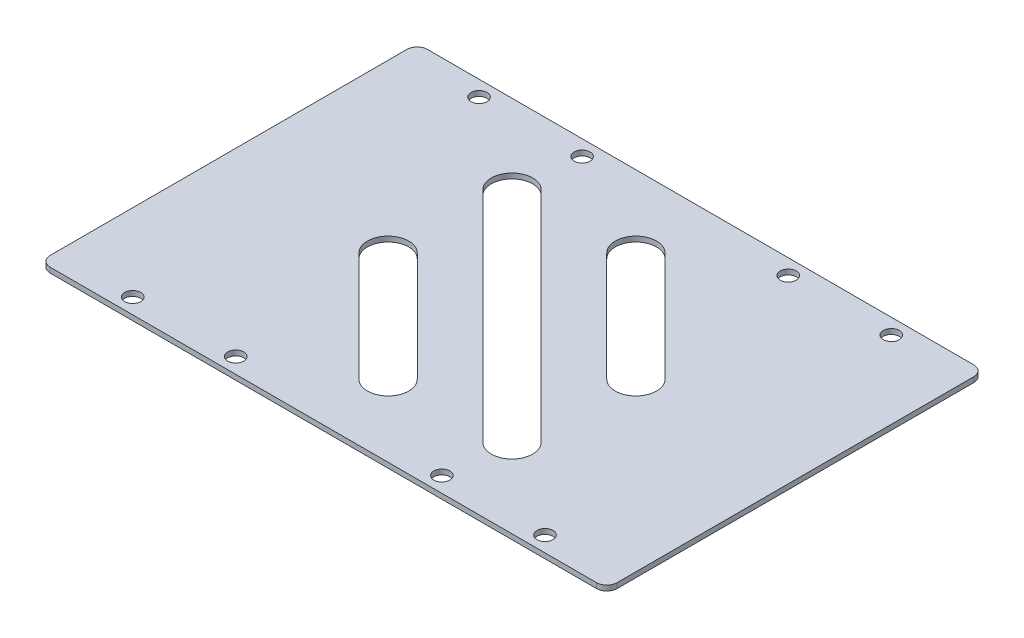
ISO-10303-21;
HEADER;
FILE_DESCRIPTION(('STEP AP214'),'2;1');
FILE_NAME('part.step','',(''),(''),'','','');
FILE_SCHEMA(('AUTOMOTIVE_DESIGN { 1 0 10303 214 1 1 1 1 }'));
ENDSEC;
DATA;
#1=APPLICATION_CONTEXT('core data for automotive mechanical design processes');
#2=APPLICATION_PROTOCOL_DEFINITION('international standard','automotive_design',2000,#1);
#3=PRODUCT_CONTEXT('',#1,'mechanical');
#4=PRODUCT('Part','Part','',(#3));
#5=PRODUCT_RELATED_PRODUCT_CATEGORY('part','',(#4));
#6=PRODUCT_DEFINITION_FORMATION('','',#4);
#7=PRODUCT_DEFINITION_CONTEXT('part definition',#1,'design');
#8=PRODUCT_DEFINITION('design','',#6,#7);
#9=PRODUCT_DEFINITION_SHAPE('','',#8);
#10=(LENGTH_UNIT() NAMED_UNIT(*) SI_UNIT(.MILLI.,.METRE.));
#11=(NAMED_UNIT(*) PLANE_ANGLE_UNIT() SI_UNIT($,.RADIAN.));
#12=(NAMED_UNIT(*) SI_UNIT($,.STERADIAN.) SOLID_ANGLE_UNIT());
#13=UNCERTAINTY_MEASURE_WITH_UNIT(LENGTH_MEASURE(1.E-05),#10,'distance_accuracy_value','');
#14=(GEOMETRIC_REPRESENTATION_CONTEXT(3) GLOBAL_UNCERTAINTY_ASSIGNED_CONTEXT((#13)) GLOBAL_UNIT_ASSIGNED_CONTEXT((#10,
#11,#12)) REPRESENTATION_CONTEXT('',''));
#15=CARTESIAN_POINT('',(0.,0.,0.));
#16=DIRECTION('',(0.,0.,1.));
#17=DIRECTION('',(1.,0.,0.));
#18=AXIS2_PLACEMENT_3D('',#15,#16,#17);
#19=CARTESIAN_POINT('',(55.,1.,-36.6));
#20=DIRECTION('',(-1.,0.,0.));
#21=DIRECTION('',(0.,0.,1.));
#22=AXIS2_PLACEMENT_3D('',#19,#20,#21);
#23=PLANE('',#22);
#24=DIRECTION('',(0.,0.,-1.));
#25=VECTOR('',#24,1.);
#26=CARTESIAN_POINT('',(55.,0.,-36.6));
#27=LINE('',#26,#25);
#28=CARTESIAN_POINT('',(55.,0.,34.6));
#29=VERTEX_POINT('',#28);
#30=CARTESIAN_POINT('',(55.,0.,-34.6));
#31=VERTEX_POINT('',#30);
#32=EDGE_CURVE('E284',#29,#31,#27,.T.);
#33=ORIENTED_EDGE('',*,*,#32,.T.);
#34=DIRECTION('',(0.,-1.,0.));
#35=VECTOR('',#34,1.);
#36=CARTESIAN_POINT('',(55.,1.,-34.6));
#37=LINE('',#36,#35);
#38=CARTESIAN_POINT('',(55.,1.,-34.6));
#39=VERTEX_POINT('',#38);
#40=EDGE_CURVE('E351',#31,#39,#37,.F.);
#41=ORIENTED_EDGE('',*,*,#40,.T.);
#42=DIRECTION('',(0.,0.,-1.));
#43=VECTOR('',#42,1.);
#44=CARTESIAN_POINT('',(55.,1.,-36.6));
#45=LINE('',#44,#43);
#46=CARTESIAN_POINT('',(55.,1.,34.6));
#47=VERTEX_POINT('',#46);
#48=EDGE_CURVE('E270',#47,#39,#45,.T.);
#49=ORIENTED_EDGE('',*,*,#48,.F.);
#50=DIRECTION('',(0.,-1.,0.));
#51=VECTOR('',#50,1.);
#52=CARTESIAN_POINT('',(55.,1.,34.6));
#53=LINE('',#52,#51);
#54=EDGE_CURVE('E348',#47,#29,#53,.T.);
#55=ORIENTED_EDGE('',*,*,#54,.T.);
#56=EDGE_LOOP('',(#33,#41,#49,#55));
#57=FACE_BOUND('',#56,.T.);
#58=ADVANCED_FACE('F42',(#57),#23,.F.);
#59=CARTESIAN_POINT('',(-55.,1.,-36.6));
#60=DIRECTION('',(0.,0.,1.));
#61=DIRECTION('',(1.,0.,0.));
#62=AXIS2_PLACEMENT_3D('',#59,#60,#61);
#63=PLANE('',#62);
#64=DIRECTION('',(-1.,0.,0.));
#65=VECTOR('',#64,1.);
#66=CARTESIAN_POINT('',(-55.,0.,-36.6));
#67=LINE('',#66,#65);
#68=CARTESIAN_POINT('',(53.,0.,-36.6));
#69=VERTEX_POINT('',#68);
#70=CARTESIAN_POINT('',(-53.,0.,-36.6));
#71=VERTEX_POINT('',#70);
#72=EDGE_CURVE('E287',#69,#71,#67,.T.);
#73=ORIENTED_EDGE('',*,*,#72,.T.);
#74=DIRECTION('',(0.,-1.,0.));
#75=VECTOR('',#74,1.);
#76=CARTESIAN_POINT('',(-53.,1.,-36.6));
#77=LINE('',#76,#75);
#78=CARTESIAN_POINT('',(-53.,1.,-36.6));
#79=VERTEX_POINT('',#78);
#80=EDGE_CURVE('E346',#71,#79,#77,.F.);
#81=ORIENTED_EDGE('',*,*,#80,.T.);
#82=DIRECTION('',(-1.,0.,0.));
#83=VECTOR('',#82,1.);
#84=CARTESIAN_POINT('',(-55.,1.,-36.6));
#85=LINE('',#84,#83);
#86=CARTESIAN_POINT('',(53.,1.,-36.6));
#87=VERTEX_POINT('',#86);
#88=EDGE_CURVE('E273',#87,#79,#85,.T.);
#89=ORIENTED_EDGE('',*,*,#88,.F.);
#90=DIRECTION('',(0.,-1.,0.));
#91=VECTOR('',#90,1.);
#92=CARTESIAN_POINT('',(53.,1.,-36.6));
#93=LINE('',#92,#91);
#94=EDGE_CURVE('E343',#87,#69,#93,.T.);
#95=ORIENTED_EDGE('',*,*,#94,.T.);
#96=EDGE_LOOP('',(#73,#81,#89,#95));
#97=FACE_BOUND('',#96,.T.);
#98=ADVANCED_FACE('F411',(#97),#63,.F.);
#99=CARTESIAN_POINT('',(-55.,1.,-36.6));
#100=DIRECTION('',(1.,0.,0.));
#101=DIRECTION('',(0.,0.,-1.));
#102=AXIS2_PLACEMENT_3D('',#99,#100,#101);
#103=PLANE('',#102);
#104=DIRECTION('',(0.,0.,1.));
#105=VECTOR('',#104,1.);
#106=CARTESIAN_POINT('',(-55.,0.,-36.6));
#107=LINE('',#106,#105);
#108=CARTESIAN_POINT('',(-55.,0.,-34.6));
#109=VERTEX_POINT('',#108);
#110=CARTESIAN_POINT('',(-55.,0.,34.6));
#111=VERTEX_POINT('',#110);
#112=EDGE_CURVE('E291',#109,#111,#107,.T.);
#113=ORIENTED_EDGE('',*,*,#112,.T.);
#114=DIRECTION('',(0.,-1.,0.));
#115=VECTOR('',#114,1.);
#116=CARTESIAN_POINT('',(-55.,1.,34.6));
#117=LINE('',#116,#115);
#118=CARTESIAN_POINT('',(-55.,1.,34.6));
#119=VERTEX_POINT('',#118);
#120=EDGE_CURVE('E333',#111,#119,#117,.F.);
#121=ORIENTED_EDGE('',*,*,#120,.T.);
#122=DIRECTION('',(0.,0.,1.));
#123=VECTOR('',#122,1.);
#124=CARTESIAN_POINT('',(-55.,1.,-36.6));
#125=LINE('',#124,#123);
#126=CARTESIAN_POINT('',(-55.,1.,-34.6));
#127=VERTEX_POINT('',#126);
#128=EDGE_CURVE('E277',#127,#119,#125,.T.);
#129=ORIENTED_EDGE('',*,*,#128,.F.);
#130=DIRECTION('',(0.,-1.,0.));
#131=VECTOR('',#130,1.);
#132=CARTESIAN_POINT('',(-55.,1.,-34.6));
#133=LINE('',#132,#131);
#134=EDGE_CURVE('E330',#127,#109,#133,.T.);
#135=ORIENTED_EDGE('',*,*,#134,.T.);
#136=EDGE_LOOP('',(#113,#121,#129,#135));
#137=FACE_BOUND('',#136,.T.);
#138=ADVANCED_FACE('F417',(#137),#103,.F.);
#139=CARTESIAN_POINT('',(-55.,1.,36.6));
#140=DIRECTION('',(0.,0.,-1.));
#141=DIRECTION('',(-1.,0.,0.));
#142=AXIS2_PLACEMENT_3D('',#139,#140,#141);
#143=PLANE('',#142);
#144=DIRECTION('',(1.,0.,0.));
#145=VECTOR('',#144,1.);
#146=CARTESIAN_POINT('',(-55.,1.,36.6));
#147=LINE('',#146,#145);
#148=CARTESIAN_POINT('',(-53.,1.,36.6));
#149=VERTEX_POINT('',#148);
#150=CARTESIAN_POINT('',(53.,1.,36.6));
#151=VERTEX_POINT('',#150);
#152=EDGE_CURVE('E280',#149,#151,#147,.T.);
#153=ORIENTED_EDGE('',*,*,#152,.F.);
#154=DIRECTION('',(0.,-1.,0.));
#155=VECTOR('',#154,1.);
#156=CARTESIAN_POINT('',(-53.,1.,36.6));
#157=LINE('',#156,#155);
#158=CARTESIAN_POINT('',(-53.,0.,36.6));
#159=VERTEX_POINT('',#158);
#160=EDGE_CURVE('E319',#149,#159,#157,.T.);
#161=ORIENTED_EDGE('',*,*,#160,.T.);
#162=DIRECTION('',(1.,0.,0.));
#163=VECTOR('',#162,1.);
#164=CARTESIAN_POINT('',(-55.,0.,36.6));
#165=LINE('',#164,#163);
#166=CARTESIAN_POINT('',(53.,0.,36.6));
#167=VERTEX_POINT('',#166);
#168=EDGE_CURVE('E274',#159,#167,#165,.T.);
#169=ORIENTED_EDGE('',*,*,#168,.T.);
#170=DIRECTION('',(0.,-1.,0.));
#171=VECTOR('',#170,1.);
#172=CARTESIAN_POINT('',(53.,1.,36.6));
#173=LINE('',#172,#171);
#174=EDGE_CURVE('E283',#167,#151,#173,.F.);
#175=ORIENTED_EDGE('',*,*,#174,.T.);
#176=EDGE_LOOP('',(#153,#161,#169,#175));
#177=FACE_BOUND('',#176,.T.);
#178=ADVANCED_FACE('F457',(#177),#143,.F.);
#179=CARTESIAN_POINT('',(0.,1.,0.));
#180=DIRECTION('',(0.,1.,0.));
#181=DIRECTION('',(0.,0.,1.));
#182=AXIS2_PLACEMENT_3D('',#179,#180,#181);
#183=PLANE('',#182);
#184=CARTESIAN_POINT('',(1.41421356237337,1.,-22.6274169979698));
#185=DIRECTION('',(0.,1.,0.));
#186=DIRECTION('',(0.,0.,1.));
#187=AXIS2_PLACEMENT_3D('',#184,#185,#186);
#188=CIRCLE('',#187,3.99999999999999);
#189=CARTESIAN_POINT('',(4.24264068711955,1.,-25.455844122716));
#190=VERTEX_POINT('',#189);
#191=CARTESIAN_POINT('',(-1.41421356237282,1.,-19.7989898732236));
#192=VERTEX_POINT('',#191);
#193=EDGE_CURVE('E57',#190,#192,#188,.T.);
#194=ORIENTED_EDGE('',*,*,#193,.F.);
#195=DIRECTION('',(-0.707106781186548,0.,-0.707106781186547));
#196=VECTOR('',#195,1.);
#197=CARTESIAN_POINT('',(4.24264068711955,1.,-25.455844122716));
#198=LINE('',#197,#196);
#199=CARTESIAN_POINT('',(25.455844122716,1.,-4.24264068711956));
#200=VERTEX_POINT('',#199);
#201=EDGE_CURVE('E212',#200,#190,#198,.T.);
#202=ORIENTED_EDGE('',*,*,#201,.F.);
#203=CARTESIAN_POINT('',(22.6274169979698,1.,-1.41421356237337));
#204=DIRECTION('',(0.,1.,0.));
#205=DIRECTION('',(0.,0.,1.));
#206=AXIS2_PLACEMENT_3D('',#203,#204,#205);
#207=CIRCLE('',#206,3.99999999999999);
#208=CARTESIAN_POINT('',(19.7989898732236,1.,1.41421356237281));
#209=VERTEX_POINT('',#208);
#210=EDGE_CURVE('E218',#209,#200,#207,.T.);
#211=ORIENTED_EDGE('',*,*,#210,.F.);
#212=DIRECTION('',(0.707106781186547,0.,0.707106781186547));
#213=VECTOR('',#212,1.);
#214=CARTESIAN_POINT('',(-1.41421356237282,1.,-19.7989898732236));
#215=LINE('',#214,#213);
#216=EDGE_CURVE('E221',#192,#209,#215,.T.);
#217=ORIENTED_EDGE('',*,*,#216,.F.);
#218=EDGE_LOOP('',(#194,#202,#211,#217));
#219=FACE_BOUND('',#218,.T.);
#220=CARTESIAN_POINT('',(-22.6274169979698,1.,1.41421356237392));
#221=DIRECTION('',(0.,1.,0.));
#222=DIRECTION('',(0.,0.,-1.));
#223=AXIS2_PLACEMENT_3D('',#220,#221,#222);
#224=CIRCLE('',#223,3.99999999999999);
#225=CARTESIAN_POINT('',(-19.7989898732236,1.,-1.41421356237233));
#226=VERTEX_POINT('',#225);
#227=CARTESIAN_POINT('',(-25.4558441227159,1.,4.24264068712017));
#228=VERTEX_POINT('',#227);
#229=EDGE_CURVE('E65',#226,#228,#224,.T.);
#230=ORIENTED_EDGE('',*,*,#229,.F.);
#231=DIRECTION('',(-0.707106781186565,0.,-0.70710678118653));
#232=VECTOR('',#231,1.);
#233=CARTESIAN_POINT('',(-19.7989898732236,1.,-1.41421356237233));
#234=LINE('',#233,#232);
#235=CARTESIAN_POINT('',(1.41421356237329,1.,19.7989898732236));
#236=VERTEX_POINT('',#235);
#237=EDGE_CURVE('E189',#236,#226,#234,.T.);
#238=ORIENTED_EDGE('',*,*,#237,.F.);
#239=CARTESIAN_POINT('',(-1.41421356237282,1.,22.6274169979698));
#240=DIRECTION('',(0.,1.,0.));
#241=DIRECTION('',(0.,0.,-1.));
#242=AXIS2_PLACEMENT_3D('',#239,#240,#241);
#243=CIRCLE('',#242,3.99999999999999);
#244=CARTESIAN_POINT('',(-4.24264068711893,1.,25.4558441227161));
#245=VERTEX_POINT('',#244);
#246=EDGE_CURVE('E195',#245,#236,#243,.T.);
#247=ORIENTED_EDGE('',*,*,#246,.F.);
#248=DIRECTION('',(0.707106781186565,0.,0.70710678118653));
#249=VECTOR('',#248,1.);
#250=CARTESIAN_POINT('',(-25.4558441227159,1.,4.24264068712017));
#251=LINE('',#250,#249);
#252=EDGE_CURVE('E202',#228,#245,#251,.T.);
#253=ORIENTED_EDGE('',*,*,#252,.F.);
#254=EDGE_LOOP('',(#230,#238,#247,#253));
#255=FACE_BOUND('',#254,.T.);
#256=CARTESIAN_POINT('',(-21.2132034355964,1.,-21.2132034355965));
#257=DIRECTION('',(0.,1.,0.));
#258=DIRECTION('',(0.,0.,1.));
#259=AXIS2_PLACEMENT_3D('',#256,#257,#258);
#260=CIRCLE('',#259,4.00000000000001);
#261=CARTESIAN_POINT('',(-18.3847763108502,1.,-24.0416305603427));
#262=VERTEX_POINT('',#261);
#263=CARTESIAN_POINT('',(-24.0416305603426,1.,-18.3847763108503));
#264=VERTEX_POINT('',#263);
#265=EDGE_CURVE('E225',#262,#264,#260,.T.);
#266=ORIENTED_EDGE('',*,*,#265,.F.);
#267=DIRECTION('',(-0.707106781186546,0.,-0.707106781186549));
#268=VECTOR('',#267,1.);
#269=CARTESIAN_POINT('',(-18.3847763108502,1.,-24.0416305603427));
#270=LINE('',#269,#268);
#271=CARTESIAN_POINT('',(24.0416305603426,1.,18.3847763108503));
#272=VERTEX_POINT('',#271);
#273=EDGE_CURVE('E233',#272,#262,#270,.T.);
#274=ORIENTED_EDGE('',*,*,#273,.F.);
#275=CARTESIAN_POINT('',(21.2132034355964,1.,21.2132034355965));
#276=DIRECTION('',(0.,1.,0.));
#277=DIRECTION('',(0.,0.,1.));
#278=AXIS2_PLACEMENT_3D('',#275,#276,#277);
#279=CIRCLE('',#278,4.00000000000001);
#280=CARTESIAN_POINT('',(18.3847763108502,1.,24.0416305603426));
#281=VERTEX_POINT('',#280);
#282=EDGE_CURVE('E230',#281,#272,#279,.T.);
#283=ORIENTED_EDGE('',*,*,#282,.F.);
#284=DIRECTION('',(0.707106781186546,0.,0.707106781186549));
#285=VECTOR('',#284,1.);
#286=CARTESIAN_POINT('',(-24.0416305603426,1.,-18.3847763108503));
#287=LINE('',#286,#285);
#288=EDGE_CURVE('E227',#264,#281,#287,.T.);
#289=ORIENTED_EDGE('',*,*,#288,.F.);
#290=EDGE_LOOP('',(#266,#274,#283,#289));
#291=FACE_BOUND('',#290,.T.);
#292=CARTESIAN_POINT('',(40.,1.,-33.6));
#293=DIRECTION('',(0.,1.,0.));
#294=DIRECTION('',(0.,0.,1.));
#295=AXIS2_PLACEMENT_3D('',#292,#293,#294);
#296=CIRCLE('',#295,1.55);
#297=CARTESIAN_POINT('',(40.,1.,-32.05));
#298=VERTEX_POINT('',#297);
#299=EDGE_CURVE('E255',#298,#298,#296,.T.);
#300=ORIENTED_EDGE('',*,*,#299,.F.);
#301=EDGE_LOOP('',(#300));
#302=FACE_BOUND('',#301,.T.);
#303=CARTESIAN_POINT('',(40.,1.,33.6));
#304=DIRECTION('',(0.,1.,0.));
#305=DIRECTION('',(0.,0.,-1.));
#306=AXIS2_PLACEMENT_3D('',#303,#304,#305);
#307=CIRCLE('',#306,1.55);
#308=CARTESIAN_POINT('',(40.,1.,32.05));
#309=VERTEX_POINT('',#308);
#310=EDGE_CURVE('E259',#309,#309,#307,.T.);
#311=ORIENTED_EDGE('',*,*,#310,.F.);
#312=EDGE_LOOP('',(#311));
#313=FACE_BOUND('',#312,.T.);
#314=CARTESIAN_POINT('',(20.,1.,33.6));
#315=DIRECTION('',(0.,1.,0.));
#316=DIRECTION('',(0.,0.,-1.));
#317=AXIS2_PLACEMENT_3D('',#314,#315,#316);
#318=CIRCLE('',#317,1.55);
#319=CARTESIAN_POINT('',(20.,1.,32.05));
#320=VERTEX_POINT('',#319);
#321=EDGE_CURVE('E262',#320,#320,#318,.T.);
#322=ORIENTED_EDGE('',*,*,#321,.F.);
#323=EDGE_LOOP('',(#322));
#324=FACE_BOUND('',#323,.T.);
#325=CARTESIAN_POINT('',(-20.,1.,33.6));
#326=DIRECTION('',(0.,1.,0.));
#327=DIRECTION('',(0.,0.,1.));
#328=AXIS2_PLACEMENT_3D('',#325,#326,#327);
#329=CIRCLE('',#328,1.55);
#330=CARTESIAN_POINT('',(-20.,1.,35.15));
#331=VERTEX_POINT('',#330);
#332=EDGE_CURVE('E249',#331,#331,#329,.T.);
#333=ORIENTED_EDGE('',*,*,#332,.F.);
#334=EDGE_LOOP('',(#333));
#335=FACE_BOUND('',#334,.T.);
#336=CARTESIAN_POINT('',(-40.,1.,33.6));
#337=DIRECTION('',(0.,1.,0.));
#338=DIRECTION('',(0.,0.,1.));
#339=AXIS2_PLACEMENT_3D('',#336,#337,#338);
#340=CIRCLE('',#339,1.55);
#341=CARTESIAN_POINT('',(-40.,1.,35.15));
#342=VERTEX_POINT('',#341);
#343=EDGE_CURVE('E246',#342,#342,#340,.T.);
#344=ORIENTED_EDGE('',*,*,#343,.F.);
#345=EDGE_LOOP('',(#344));
#346=FACE_BOUND('',#345,.T.);
#347=CARTESIAN_POINT('',(-40.,1.,-33.6));
#348=DIRECTION('',(0.,1.,0.));
#349=DIRECTION('',(0.,0.,-1.));
#350=AXIS2_PLACEMENT_3D('',#347,#348,#349);
#351=CIRCLE('',#350,1.55);
#352=CARTESIAN_POINT('',(-40.,1.,-35.15));
#353=VERTEX_POINT('',#352);
#354=EDGE_CURVE('E250',#353,#353,#351,.T.);
#355=ORIENTED_EDGE('',*,*,#354,.F.);
#356=EDGE_LOOP('',(#355));
#357=FACE_BOUND('',#356,.T.);
#358=CARTESIAN_POINT('',(-20.,1.,-33.6));
#359=DIRECTION('',(0.,1.,0.));
#360=DIRECTION('',(0.,0.,-1.));
#361=AXIS2_PLACEMENT_3D('',#358,#359,#360);
#362=CIRCLE('',#361,1.55);
#363=CARTESIAN_POINT('',(-20.,1.,-35.15));
#364=VERTEX_POINT('',#363);
#365=EDGE_CURVE('E239',#364,#364,#362,.T.);
#366=ORIENTED_EDGE('',*,*,#365,.F.);
#367=EDGE_LOOP('',(#366));
#368=FACE_BOUND('',#367,.T.);
#369=CARTESIAN_POINT('',(20.,1.,-33.6));
#370=DIRECTION('',(0.,1.,0.));
#371=DIRECTION('',(0.,0.,1.));
#372=AXIS2_PLACEMENT_3D('',#369,#370,#371);
#373=CIRCLE('',#372,1.55);
#374=CARTESIAN_POINT('',(20.,1.,-32.05));
#375=VERTEX_POINT('',#374);
#376=EDGE_CURVE('E258',#375,#375,#373,.T.);
#377=ORIENTED_EDGE('',*,*,#376,.F.);
#378=EDGE_LOOP('',(#377));
#379=FACE_BOUND('',#378,.T.);
#380=ORIENTED_EDGE('',*,*,#128,.T.);
#381=CARTESIAN_POINT('',(-53.,1.,34.6));
#382=DIRECTION('',(0.,1.,0.));
#383=DIRECTION('',(0.,0.,1.));
#384=AXIS2_PLACEMENT_3D('',#381,#382,#383);
#385=CIRCLE('',#384,2.);
#386=EDGE_CURVE('E341',#119,#149,#385,.T.);
#387=ORIENTED_EDGE('',*,*,#386,.T.);
#388=ORIENTED_EDGE('',*,*,#152,.T.);
#389=CARTESIAN_POINT('',(53.,1.,34.6));
#390=DIRECTION('',(0.,1.,0.));
#391=DIRECTION('',(0.,0.,1.));
#392=AXIS2_PLACEMENT_3D('',#389,#390,#391);
#393=CIRCLE('',#392,2.);
#394=EDGE_CURVE('E335',#151,#47,#393,.T.);
#395=ORIENTED_EDGE('',*,*,#394,.T.);
#396=ORIENTED_EDGE('',*,*,#48,.T.);
#397=CARTESIAN_POINT('',(53.,1.,-34.6));
#398=DIRECTION('',(0.,1.,0.));
#399=DIRECTION('',(0.,0.,1.));
#400=AXIS2_PLACEMENT_3D('',#397,#398,#399);
#401=CIRCLE('',#400,2.);
#402=EDGE_CURVE('E337',#39,#87,#401,.T.);
#403=ORIENTED_EDGE('',*,*,#402,.T.);
#404=ORIENTED_EDGE('',*,*,#88,.T.);
#405=CARTESIAN_POINT('',(-53.,1.,-34.6));
#406=DIRECTION('',(0.,1.,0.));
#407=DIRECTION('',(0.,0.,1.));
#408=AXIS2_PLACEMENT_3D('',#405,#406,#407);
#409=CIRCLE('',#408,2.);
#410=EDGE_CURVE('E339',#79,#127,#409,.T.);
#411=ORIENTED_EDGE('',*,*,#410,.T.);
#412=EDGE_LOOP('',(#380,#387,#388,#395,#396,#403,#404,#411));
#413=FACE_BOUND('',#412,.T.);
#414=ADVANCED_FACE('F199',(#219,#255,#291,#302,#313,#324,#335,#346,#357,#368,#379,#413),#183,.T.);
#415=CARTESIAN_POINT('',(0.,0.,0.));
#416=DIRECTION('',(0.,1.,0.));
#417=DIRECTION('',(0.,0.,1.));
#418=AXIS2_PLACEMENT_3D('',#415,#416,#417);
#419=PLANE('',#418);
#420=DIRECTION('',(-0.707106781186548,0.,-0.707106781186547));
#421=VECTOR('',#420,1.);
#422=CARTESIAN_POINT('',(14.8492424049178,0.,-14.8492424049178));
#423=LINE('',#422,#421);
#424=CARTESIAN_POINT('',(25.455844122716,0.,-4.24264068711956));
#425=VERTEX_POINT('',#424);
#426=CARTESIAN_POINT('',(4.24264068711955,0.,-25.455844122716));
#427=VERTEX_POINT('',#426);
#428=EDGE_CURVE('E50',#425,#427,#423,.T.);
#429=ORIENTED_EDGE('',*,*,#428,.T.);
#430=CARTESIAN_POINT('',(1.41421356237337,0.,-22.6274169979698));
#431=DIRECTION('',(0.,1.,0.));
#432=DIRECTION('',(0.,0.,1.));
#433=AXIS2_PLACEMENT_3D('',#430,#431,#432);
#434=CIRCLE('',#433,3.99999999999999);
#435=CARTESIAN_POINT('',(-1.41421356237282,0.,-19.7989898732236));
#436=VERTEX_POINT('',#435);
#437=EDGE_CURVE('E11',#427,#436,#434,.T.);
#438=ORIENTED_EDGE('',*,*,#437,.T.);
#439=DIRECTION('',(0.707106781186548,0.,0.707106781186548));
#440=VECTOR('',#439,1.);
#441=CARTESIAN_POINT('',(9.1923881554254,0.,-9.1923881554254));
#442=LINE('',#441,#440);
#443=CARTESIAN_POINT('',(19.7989898732236,0.,1.41421356237281));
#444=VERTEX_POINT('',#443);
#445=EDGE_CURVE('E374',#436,#444,#442,.T.);
#446=ORIENTED_EDGE('',*,*,#445,.T.);
#447=CARTESIAN_POINT('',(22.6274169979698,0.,-1.41421356237337));
#448=DIRECTION('',(0.,1.,0.));
#449=DIRECTION('',(0.,0.,1.));
#450=AXIS2_PLACEMENT_3D('',#447,#448,#449);
#451=CIRCLE('',#450,3.99999999999999);
#452=EDGE_CURVE('E377',#444,#425,#451,.T.);
#453=ORIENTED_EDGE('',*,*,#452,.T.);
#454=EDGE_LOOP('',(#429,#438,#446,#453));
#455=FACE_BOUND('',#454,.T.);
#456=DIRECTION('',(-0.707106781186565,0.,-0.70710678118653));
#457=VECTOR('',#456,1.);
#458=CARTESIAN_POINT('',(-9.19238815542517,0.,9.19238815542562));
#459=LINE('',#458,#457);
#460=CARTESIAN_POINT('',(1.41421356237329,0.,19.7989898732236));
#461=VERTEX_POINT('',#460);
#462=CARTESIAN_POINT('',(-19.7989898732236,0.,-1.41421356237233));
#463=VERTEX_POINT('',#462);
#464=EDGE_CURVE('E371',#461,#463,#459,.T.);
#465=ORIENTED_EDGE('',*,*,#464,.T.);
#466=CARTESIAN_POINT('',(-22.6274169979698,0.,1.41421356237392));
#467=DIRECTION('',(0.,1.,0.));
#468=DIRECTION('',(0.,0.,1.));
#469=AXIS2_PLACEMENT_3D('',#466,#467,#468);
#470=CIRCLE('',#469,3.99999999999999);
#471=CARTESIAN_POINT('',(-25.4558441227159,0.,4.24264068712017));
#472=VERTEX_POINT('',#471);
#473=EDGE_CURVE('E183',#463,#472,#470,.T.);
#474=ORIENTED_EDGE('',*,*,#473,.T.);
#475=DIRECTION('',(0.707106781186565,0.,0.70710678118653));
#476=VECTOR('',#475,1.);
#477=CARTESIAN_POINT('',(-14.8492424049174,0.,14.8492424049181));
#478=LINE('',#477,#476);
#479=CARTESIAN_POINT('',(-4.24264068711894,0.,25.4558441227161));
#480=VERTEX_POINT('',#479);
#481=EDGE_CURVE('E365',#472,#480,#478,.T.);
#482=ORIENTED_EDGE('',*,*,#481,.T.);
#483=CARTESIAN_POINT('',(-1.41421356237282,0.,22.6274169979698));
#484=DIRECTION('',(0.,1.,0.));
#485=DIRECTION('',(0.,0.,1.));
#486=AXIS2_PLACEMENT_3D('',#483,#484,#485);
#487=CIRCLE('',#486,3.99999999999999);
#488=EDGE_CURVE('E368',#480,#461,#487,.T.);
#489=ORIENTED_EDGE('',*,*,#488,.T.);
#490=EDGE_LOOP('',(#465,#474,#482,#489));
#491=FACE_BOUND('',#490,.T.);
#492=DIRECTION('',(-0.707106781186546,0.,-0.707106781186549));
#493=VECTOR('',#492,1.);
#494=CARTESIAN_POINT('',(2.82842712474621,0.,-2.8284271247462));
#495=LINE('',#494,#493);
#496=CARTESIAN_POINT('',(24.0416305603426,0.,18.3847763108503));
#497=VERTEX_POINT('',#496);
#498=CARTESIAN_POINT('',(-18.3847763108502,0.,-24.0416305603427));
#499=VERTEX_POINT('',#498);
#500=EDGE_CURVE('E359',#497,#499,#495,.T.);
#501=ORIENTED_EDGE('',*,*,#500,.T.);
#502=CARTESIAN_POINT('',(-21.2132034355964,0.,-21.2132034355965));
#503=DIRECTION('',(0.,1.,0.));
#504=DIRECTION('',(0.,0.,1.));
#505=AXIS2_PLACEMENT_3D('',#502,#503,#504);
#506=CIRCLE('',#505,4.00000000000001);
#507=CARTESIAN_POINT('',(-24.0416305603426,0.,-18.3847763108503));
#508=VERTEX_POINT('',#507);
#509=EDGE_CURVE('E362',#499,#508,#506,.T.);
#510=ORIENTED_EDGE('',*,*,#509,.T.);
#511=DIRECTION('',(0.707106781186546,0.,0.707106781186549));
#512=VECTOR('',#511,1.);
#513=CARTESIAN_POINT('',(-2.82842712474619,0.,2.82842712474618));
#514=LINE('',#513,#512);
#515=CARTESIAN_POINT('',(18.3847763108502,0.,24.0416305603426));
#516=VERTEX_POINT('',#515);
#517=EDGE_CURVE('E353',#508,#516,#514,.T.);
#518=ORIENTED_EDGE('',*,*,#517,.T.);
#519=CARTESIAN_POINT('',(21.2132034355964,0.,21.2132034355965));
#520=DIRECTION('',(0.,1.,0.));
#521=DIRECTION('',(0.,0.,1.));
#522=AXIS2_PLACEMENT_3D('',#519,#520,#521);
#523=CIRCLE('',#522,4.00000000000001);
#524=EDGE_CURVE('E356',#516,#497,#523,.T.);
#525=ORIENTED_EDGE('',*,*,#524,.T.);
#526=EDGE_LOOP('',(#501,#510,#518,#525));
#527=FACE_BOUND('',#526,.T.);
#528=CARTESIAN_POINT('',(40.,0.,-33.6));
#529=DIRECTION('',(0.,1.,0.));
#530=DIRECTION('',(0.,0.,1.));
#531=AXIS2_PLACEMENT_3D('',#528,#529,#530);
#532=CIRCLE('',#531,1.55);
#533=CARTESIAN_POINT('',(40.,0.,-32.05));
#534=VERTEX_POINT('',#533);
#535=EDGE_CURVE('E288',#534,#534,#532,.T.);
#536=ORIENTED_EDGE('',*,*,#535,.T.);
#537=EDGE_LOOP('',(#536));
#538=FACE_BOUND('',#537,.T.);
#539=CARTESIAN_POINT('',(40.,0.,33.6));
#540=DIRECTION('',(0.,1.,0.));
#541=DIRECTION('',(0.,0.,1.));
#542=AXIS2_PLACEMENT_3D('',#539,#540,#541);
#543=CIRCLE('',#542,1.55);
#544=CARTESIAN_POINT('',(40.,0.,35.15));
#545=VERTEX_POINT('',#544);
#546=EDGE_CURVE('E313',#545,#545,#543,.T.);
#547=ORIENTED_EDGE('',*,*,#546,.T.);
#548=EDGE_LOOP('',(#547));
#549=FACE_BOUND('',#548,.T.);
#550=CARTESIAN_POINT('',(20.,0.,33.6));
#551=DIRECTION('',(0.,1.,0.));
#552=DIRECTION('',(0.,0.,1.));
#553=AXIS2_PLACEMENT_3D('',#550,#551,#552);
#554=CIRCLE('',#553,1.55);
#555=CARTESIAN_POINT('',(20.,0.,35.15));
#556=VERTEX_POINT('',#555);
#557=EDGE_CURVE('E310',#556,#556,#554,.T.);
#558=ORIENTED_EDGE('',*,*,#557,.T.);
#559=EDGE_LOOP('',(#558));
#560=FACE_BOUND('',#559,.T.);
#561=CARTESIAN_POINT('',(-20.,0.,33.6));
#562=DIRECTION('',(0.,1.,0.));
#563=DIRECTION('',(0.,0.,1.));
#564=AXIS2_PLACEMENT_3D('',#561,#562,#563);
#565=CIRCLE('',#564,1.55);
#566=CARTESIAN_POINT('',(-20.,0.,35.15));
#567=VERTEX_POINT('',#566);
#568=EDGE_CURVE('E307',#567,#567,#565,.T.);
#569=ORIENTED_EDGE('',*,*,#568,.T.);
#570=EDGE_LOOP('',(#569));
#571=FACE_BOUND('',#570,.T.);
#572=CARTESIAN_POINT('',(-40.,0.,33.6));
#573=DIRECTION('',(0.,1.,0.));
#574=DIRECTION('',(0.,0.,1.));
#575=AXIS2_PLACEMENT_3D('',#572,#573,#574);
#576=CIRCLE('',#575,1.55);
#577=CARTESIAN_POINT('',(-40.,0.,35.15));
#578=VERTEX_POINT('',#577);
#579=EDGE_CURVE('E304',#578,#578,#576,.T.);
#580=ORIENTED_EDGE('',*,*,#579,.T.);
#581=EDGE_LOOP('',(#580));
#582=FACE_BOUND('',#581,.T.);
#583=CARTESIAN_POINT('',(-40.,0.,-33.6));
#584=DIRECTION('',(0.,1.,0.));
#585=DIRECTION('',(0.,0.,1.));
#586=AXIS2_PLACEMENT_3D('',#583,#584,#585);
#587=CIRCLE('',#586,1.55);
#588=CARTESIAN_POINT('',(-40.,0.,-32.05));
#589=VERTEX_POINT('',#588);
#590=EDGE_CURVE('E301',#589,#589,#587,.T.);
#591=ORIENTED_EDGE('',*,*,#590,.T.);
#592=EDGE_LOOP('',(#591));
#593=FACE_BOUND('',#592,.T.);
#594=CARTESIAN_POINT('',(-20.,0.,-33.6));
#595=DIRECTION('',(0.,1.,0.));
#596=DIRECTION('',(0.,0.,1.));
#597=AXIS2_PLACEMENT_3D('',#594,#595,#596);
#598=CIRCLE('',#597,1.55);
#599=CARTESIAN_POINT('',(-20.,0.,-32.05));
#600=VERTEX_POINT('',#599);
#601=EDGE_CURVE('E298',#600,#600,#598,.T.);
#602=ORIENTED_EDGE('',*,*,#601,.T.);
#603=EDGE_LOOP('',(#602));
#604=FACE_BOUND('',#603,.T.);
#605=CARTESIAN_POINT('',(20.,0.,-33.6));
#606=DIRECTION('',(0.,1.,0.));
#607=DIRECTION('',(0.,0.,1.));
#608=AXIS2_PLACEMENT_3D('',#605,#606,#607);
#609=CIRCLE('',#608,1.55);
#610=CARTESIAN_POINT('',(20.,0.,-32.05));
#611=VERTEX_POINT('',#610);
#612=EDGE_CURVE('E269',#611,#611,#609,.T.);
#613=ORIENTED_EDGE('',*,*,#612,.T.);
#614=EDGE_LOOP('',(#613));
#615=FACE_BOUND('',#614,.T.);
#616=ORIENTED_EDGE('',*,*,#168,.F.);
#617=CARTESIAN_POINT('',(-53.,0.,34.6));
#618=DIRECTION('',(0.,1.,0.));
#619=DIRECTION('',(0.,0.,1.));
#620=AXIS2_PLACEMENT_3D('',#617,#618,#619);
#621=CIRCLE('',#620,2.);
#622=EDGE_CURVE('E328',#159,#111,#621,.F.);
#623=ORIENTED_EDGE('',*,*,#622,.T.);
#624=ORIENTED_EDGE('',*,*,#112,.F.);
#625=CARTESIAN_POINT('',(-53.,0.,-34.6));
#626=DIRECTION('',(0.,1.,0.));
#627=DIRECTION('',(0.,0.,1.));
#628=AXIS2_PLACEMENT_3D('',#625,#626,#627);
#629=CIRCLE('',#628,2.);
#630=EDGE_CURVE('E326',#109,#71,#629,.F.);
#631=ORIENTED_EDGE('',*,*,#630,.T.);
#632=ORIENTED_EDGE('',*,*,#72,.F.);
#633=CARTESIAN_POINT('',(53.,0.,-34.6));
#634=DIRECTION('',(0.,1.,0.));
#635=DIRECTION('',(0.,0.,1.));
#636=AXIS2_PLACEMENT_3D('',#633,#634,#635);
#637=CIRCLE('',#636,2.);
#638=EDGE_CURVE('E324',#69,#31,#637,.F.);
#639=ORIENTED_EDGE('',*,*,#638,.T.);
#640=ORIENTED_EDGE('',*,*,#32,.F.);
#641=CARTESIAN_POINT('',(53.,0.,34.6));
#642=DIRECTION('',(0.,1.,0.));
#643=DIRECTION('',(0.,0.,1.));
#644=AXIS2_PLACEMENT_3D('',#641,#642,#643);
#645=CIRCLE('',#644,2.);
#646=EDGE_CURVE('E322',#29,#167,#645,.F.);
#647=ORIENTED_EDGE('',*,*,#646,.T.);
#648=EDGE_LOOP('',(#616,#623,#624,#631,#632,#639,#640,#647));
#649=FACE_BOUND('',#648,.T.);
#650=ADVANCED_FACE('F381',(#455,#491,#527,#538,#549,#560,#571,#582,#593,#604,#615,#649),#419,.F.);
#651=CARTESIAN_POINT('',(20.,-4.,-33.6));
#652=DIRECTION('',(0.,1.,0.));
#653=DIRECTION('',(0.,0.,1.));
#654=AXIS2_PLACEMENT_3D('',#651,#652,#653);
#655=CYLINDRICAL_SURFACE('',#654,1.55);
#656=ORIENTED_EDGE('',*,*,#376,.T.);
#657=EDGE_LOOP('',(#656));
#658=FACE_BOUND('',#657,.T.);
#659=ORIENTED_EDGE('',*,*,#612,.F.);
#660=EDGE_LOOP('',(#659));
#661=FACE_BOUND('',#660,.T.);
#662=ADVANCED_FACE('F464',(#658,#661),#655,.F.);
#663=CARTESIAN_POINT('',(-20.,-4.,-33.6));
#664=DIRECTION('',(0.,1.,0.));
#665=DIRECTION('',(0.,0.,1.));
#666=AXIS2_PLACEMENT_3D('',#663,#664,#665);
#667=CYLINDRICAL_SURFACE('',#666,1.55);
#668=ORIENTED_EDGE('',*,*,#365,.T.);
#669=EDGE_LOOP('',(#668));
#670=FACE_BOUND('',#669,.T.);
#671=ORIENTED_EDGE('',*,*,#601,.F.);
#672=EDGE_LOOP('',(#671));
#673=FACE_BOUND('',#672,.T.);
#674=ADVANCED_FACE('F470',(#670,#673),#667,.F.);
#675=CARTESIAN_POINT('',(-40.,-4.,-33.6));
#676=DIRECTION('',(0.,1.,0.));
#677=DIRECTION('',(0.,0.,1.));
#678=AXIS2_PLACEMENT_3D('',#675,#676,#677);
#679=CYLINDRICAL_SURFACE('',#678,1.55);
#680=ORIENTED_EDGE('',*,*,#354,.T.);
#681=EDGE_LOOP('',(#680));
#682=FACE_BOUND('',#681,.T.);
#683=ORIENTED_EDGE('',*,*,#590,.F.);
#684=EDGE_LOOP('',(#683));
#685=FACE_BOUND('',#684,.T.);
#686=ADVANCED_FACE('F687',(#682,#685),#679,.F.);
#687=CARTESIAN_POINT('',(-40.,-4.,33.6));
#688=DIRECTION('',(0.,1.,0.));
#689=DIRECTION('',(0.,0.,1.));
#690=AXIS2_PLACEMENT_3D('',#687,#688,#689);
#691=CYLINDRICAL_SURFACE('',#690,1.55);
#692=ORIENTED_EDGE('',*,*,#343,.T.);
#693=EDGE_LOOP('',(#692));
#694=FACE_BOUND('',#693,.T.);
#695=ORIENTED_EDGE('',*,*,#579,.F.);
#696=EDGE_LOOP('',(#695));
#697=FACE_BOUND('',#696,.T.);
#698=ADVANCED_FACE('F677',(#694,#697),#691,.F.);
#699=CARTESIAN_POINT('',(-20.,-4.,33.6));
#700=DIRECTION('',(0.,1.,0.));
#701=DIRECTION('',(0.,0.,1.));
#702=AXIS2_PLACEMENT_3D('',#699,#700,#701);
#703=CYLINDRICAL_SURFACE('',#702,1.55);
#704=ORIENTED_EDGE('',*,*,#332,.T.);
#705=EDGE_LOOP('',(#704));
#706=FACE_BOUND('',#705,.T.);
#707=ORIENTED_EDGE('',*,*,#568,.F.);
#708=EDGE_LOOP('',(#707));
#709=FACE_BOUND('',#708,.T.);
#710=ADVANCED_FACE('F667',(#706,#709),#703,.F.);
#711=CARTESIAN_POINT('',(20.,-4.,33.6));
#712=DIRECTION('',(0.,1.,0.));
#713=DIRECTION('',(0.,0.,1.));
#714=AXIS2_PLACEMENT_3D('',#711,#712,#713);
#715=CYLINDRICAL_SURFACE('',#714,1.55);
#716=ORIENTED_EDGE('',*,*,#321,.T.);
#717=EDGE_LOOP('',(#716));
#718=FACE_BOUND('',#717,.T.);
#719=ORIENTED_EDGE('',*,*,#557,.F.);
#720=EDGE_LOOP('',(#719));
#721=FACE_BOUND('',#720,.T.);
#722=ADVANCED_FACE('F657',(#718,#721),#715,.F.);
#723=CARTESIAN_POINT('',(40.,-4.,33.6));
#724=DIRECTION('',(0.,1.,0.));
#725=DIRECTION('',(0.,0.,1.));
#726=AXIS2_PLACEMENT_3D('',#723,#724,#725);
#727=CYLINDRICAL_SURFACE('',#726,1.55);
#728=ORIENTED_EDGE('',*,*,#310,.T.);
#729=EDGE_LOOP('',(#728));
#730=FACE_BOUND('',#729,.T.);
#731=ORIENTED_EDGE('',*,*,#546,.F.);
#732=EDGE_LOOP('',(#731));
#733=FACE_BOUND('',#732,.T.);
#734=ADVANCED_FACE('F647',(#730,#733),#727,.F.);
#735=CARTESIAN_POINT('',(40.,-4.,-33.6));
#736=DIRECTION('',(0.,1.,0.));
#737=DIRECTION('',(0.,0.,1.));
#738=AXIS2_PLACEMENT_3D('',#735,#736,#737);
#739=CYLINDRICAL_SURFACE('',#738,1.55);
#740=ORIENTED_EDGE('',*,*,#299,.T.);
#741=EDGE_LOOP('',(#740));
#742=FACE_BOUND('',#741,.T.);
#743=ORIENTED_EDGE('',*,*,#535,.F.);
#744=EDGE_LOOP('',(#743));
#745=FACE_BOUND('',#744,.T.);
#746=ADVANCED_FACE('F426',(#742,#745),#739,.F.);
#747=CARTESIAN_POINT('',(-53.,1.,34.6));
#748=DIRECTION('',(0.,-1.,0.));
#749=DIRECTION('',(0.,0.,-1.));
#750=AXIS2_PLACEMENT_3D('',#747,#748,#749);
#751=CYLINDRICAL_SURFACE('',#750,2.);
#752=ORIENTED_EDGE('',*,*,#386,.F.);
#753=ORIENTED_EDGE('',*,*,#120,.F.);
#754=ORIENTED_EDGE('',*,*,#622,.F.);
#755=ORIENTED_EDGE('',*,*,#160,.F.);
#756=EDGE_LOOP('',(#752,#753,#754,#755));
#757=FACE_BOUND('',#756,.T.);
#758=ADVANCED_FACE('F422',(#757),#751,.T.);
#759=CARTESIAN_POINT('',(-53.,1.,-34.6));
#760=DIRECTION('',(0.,-1.,0.));
#761=DIRECTION('',(0.,0.,-1.));
#762=AXIS2_PLACEMENT_3D('',#759,#760,#761);
#763=CYLINDRICAL_SURFACE('',#762,2.);
#764=ORIENTED_EDGE('',*,*,#410,.F.);
#765=ORIENTED_EDGE('',*,*,#80,.F.);
#766=ORIENTED_EDGE('',*,*,#630,.F.);
#767=ORIENTED_EDGE('',*,*,#134,.F.);
#768=EDGE_LOOP('',(#764,#765,#766,#767));
#769=FACE_BOUND('',#768,.T.);
#770=ADVANCED_FACE('F425',(#769),#763,.T.);
#771=CARTESIAN_POINT('',(53.,1.,-34.6));
#772=DIRECTION('',(0.,-1.,0.));
#773=DIRECTION('',(0.,0.,-1.));
#774=AXIS2_PLACEMENT_3D('',#771,#772,#773);
#775=CYLINDRICAL_SURFACE('',#774,2.);
#776=ORIENTED_EDGE('',*,*,#402,.F.);
#777=ORIENTED_EDGE('',*,*,#40,.F.);
#778=ORIENTED_EDGE('',*,*,#638,.F.);
#779=ORIENTED_EDGE('',*,*,#94,.F.);
#780=EDGE_LOOP('',(#776,#777,#778,#779));
#781=FACE_BOUND('',#780,.T.);
#782=ADVANCED_FACE('F429',(#781),#775,.T.);
#783=CARTESIAN_POINT('',(53.,1.,34.6));
#784=DIRECTION('',(0.,-1.,0.));
#785=DIRECTION('',(0.,0.,-1.));
#786=AXIS2_PLACEMENT_3D('',#783,#784,#785);
#787=CYLINDRICAL_SURFACE('',#786,2.);
#788=ORIENTED_EDGE('',*,*,#394,.F.);
#789=ORIENTED_EDGE('',*,*,#174,.F.);
#790=ORIENTED_EDGE('',*,*,#646,.F.);
#791=ORIENTED_EDGE('',*,*,#54,.F.);
#792=EDGE_LOOP('',(#788,#789,#790,#791));
#793=FACE_BOUND('',#792,.T.);
#794=ADVANCED_FACE('F44',(#793),#787,.T.);
#795=CARTESIAN_POINT('',(-21.2132034355964,-9.,-21.2132034355965));
#796=DIRECTION('',(0.,1.,0.));
#797=DIRECTION('',(0.,0.,1.));
#798=AXIS2_PLACEMENT_3D('',#795,#796,#797);
#799=CYLINDRICAL_SURFACE('',#798,4.00000000000001);
#800=DIRECTION('',(0.,1.,0.));
#801=VECTOR('',#800,1.);
#802=CARTESIAN_POINT('',(-18.3847763108502,-9.,-24.0416305603427));
#803=LINE('',#802,#801);
#804=EDGE_CURVE('E237',#499,#262,#803,.T.);
#805=ORIENTED_EDGE('',*,*,#804,.T.);
#806=ORIENTED_EDGE('',*,*,#265,.T.);
#807=DIRECTION('',(0.,1.,0.));
#808=VECTOR('',#807,1.);
#809=CARTESIAN_POINT('',(-24.0416305603426,-9.,-18.3847763108503));
#810=LINE('',#809,#808);
#811=EDGE_CURVE('E236',#508,#264,#810,.T.);
#812=ORIENTED_EDGE('',*,*,#811,.F.);
#813=ORIENTED_EDGE('',*,*,#509,.F.);
#814=EDGE_LOOP('',(#805,#806,#812,#813));
#815=FACE_BOUND('',#814,.T.);
#816=ADVANCED_FACE('F436',(#815),#799,.F.);
#817=CARTESIAN_POINT('',(-18.3847763108502,-9.,-24.0416305603427));
#818=DIRECTION('',(0.707106781186549,0.,-0.707106781186546));
#819=DIRECTION('',(-0.707106781186546,0.,-0.707106781186549));
#820=AXIS2_PLACEMENT_3D('',#817,#818,#819);
#821=PLANE('',#820);
#822=DIRECTION('',(0.,1.,0.));
#823=VECTOR('',#822,1.);
#824=CARTESIAN_POINT('',(24.0416305603426,-9.,18.3847763108503));
#825=LINE('',#824,#823);
#826=EDGE_CURVE('E240',#497,#272,#825,.T.);
#827=ORIENTED_EDGE('',*,*,#826,.T.);
#828=ORIENTED_EDGE('',*,*,#273,.T.);
#829=ORIENTED_EDGE('',*,*,#804,.F.);
#830=ORIENTED_EDGE('',*,*,#500,.F.);
#831=EDGE_LOOP('',(#827,#828,#829,#830));
#832=FACE_BOUND('',#831,.T.);
#833=ADVANCED_FACE('F509',(#832),#821,.F.);
#834=CARTESIAN_POINT('',(21.2132034355964,-9.,21.2132034355965));
#835=DIRECTION('',(0.,1.,0.));
#836=DIRECTION('',(0.,0.,1.));
#837=AXIS2_PLACEMENT_3D('',#834,#835,#836);
#838=CYLINDRICAL_SURFACE('',#837,4.00000000000001);
#839=DIRECTION('',(0.,1.,0.));
#840=VECTOR('',#839,1.);
#841=CARTESIAN_POINT('',(18.3847763108502,-9.,24.0416305603426));
#842=LINE('',#841,#840);
#843=EDGE_CURVE('E242',#516,#281,#842,.T.);
#844=ORIENTED_EDGE('',*,*,#843,.T.);
#845=ORIENTED_EDGE('',*,*,#282,.T.);
#846=ORIENTED_EDGE('',*,*,#826,.F.);
#847=ORIENTED_EDGE('',*,*,#524,.F.);
#848=EDGE_LOOP('',(#844,#845,#846,#847));
#849=FACE_BOUND('',#848,.T.);
#850=ADVANCED_FACE('F520',(#849),#838,.F.);
#851=CARTESIAN_POINT('',(-24.0416305603426,-9.,-18.3847763108503));
#852=DIRECTION('',(-0.707106781186549,0.,0.707106781186546));
#853=DIRECTION('',(0.707106781186546,0.,0.707106781186549));
#854=AXIS2_PLACEMENT_3D('',#851,#852,#853);
#855=PLANE('',#854);
#856=ORIENTED_EDGE('',*,*,#811,.T.);
#857=ORIENTED_EDGE('',*,*,#288,.T.);
#858=ORIENTED_EDGE('',*,*,#843,.F.);
#859=ORIENTED_EDGE('',*,*,#517,.F.);
#860=EDGE_LOOP('',(#856,#857,#858,#859));
#861=FACE_BOUND('',#860,.T.);
#862=ADVANCED_FACE('F531',(#861),#855,.F.);
#863=CARTESIAN_POINT('',(-22.6274169979698,-9.,1.41421356237392));
#864=DIRECTION('',(0.,1.,0.));
#865=DIRECTION('',(0.,0.,1.));
#866=AXIS2_PLACEMENT_3D('',#863,#864,#865);
#867=CYLINDRICAL_SURFACE('',#866,3.99999999999999);
#868=DIRECTION('',(0.,1.,0.));
#869=VECTOR('',#868,1.);
#870=CARTESIAN_POINT('',(-19.7989898732236,-9.,-1.41421356237233));
#871=LINE('',#870,#869);
#872=EDGE_CURVE('E179',#463,#226,#871,.T.);
#873=ORIENTED_EDGE('',*,*,#872,.T.);
#874=ORIENTED_EDGE('',*,*,#229,.T.);
#875=DIRECTION('',(0.,1.,0.));
#876=VECTOR('',#875,1.);
#877=CARTESIAN_POINT('',(-25.4558441227159,-9.,4.24264068712017));
#878=LINE('',#877,#876);
#879=EDGE_CURVE('E196',#472,#228,#878,.T.);
#880=ORIENTED_EDGE('',*,*,#879,.F.);
#881=ORIENTED_EDGE('',*,*,#473,.F.);
#882=EDGE_LOOP('',(#873,#874,#880,#881));
#883=FACE_BOUND('',#882,.T.);
#884=ADVANCED_FACE('F181',(#883),#867,.F.);
#885=CARTESIAN_POINT('',(-19.7989898732236,-9.,-1.41421356237233));
#886=DIRECTION('',(0.70710678118653,0.,-0.707106781186565));
#887=DIRECTION('',(-0.707106781186565,0.,-0.70710678118653));
#888=AXIS2_PLACEMENT_3D('',#885,#886,#887);
#889=PLANE('',#888);
#890=DIRECTION('',(0.,1.,0.));
#891=VECTOR('',#890,1.);
#892=CARTESIAN_POINT('',(1.41421356237329,-9.,19.7989898732236));
#893=LINE('',#892,#891);
#894=EDGE_CURVE('E186',#461,#236,#893,.T.);
#895=ORIENTED_EDGE('',*,*,#894,.T.);
#896=ORIENTED_EDGE('',*,*,#237,.T.);
#897=ORIENTED_EDGE('',*,*,#872,.F.);
#898=ORIENTED_EDGE('',*,*,#464,.F.);
#899=EDGE_LOOP('',(#895,#896,#897,#898));
#900=FACE_BOUND('',#899,.T.);
#901=ADVANCED_FACE('F190',(#900),#889,.F.);
#902=CARTESIAN_POINT('',(-1.41421356237282,-9.,22.6274169979698));
#903=DIRECTION('',(0.,1.,0.));
#904=DIRECTION('',(0.,0.,1.));
#905=AXIS2_PLACEMENT_3D('',#902,#903,#904);
#906=CYLINDRICAL_SURFACE('',#905,3.99999999999999);
#907=DIRECTION('',(0.,1.,0.));
#908=VECTOR('',#907,1.);
#909=CARTESIAN_POINT('',(-4.24264068711893,-9.,25.4558441227161));
#910=LINE('',#909,#908);
#911=EDGE_CURVE('E799',#480,#245,#910,.T.);
#912=ORIENTED_EDGE('',*,*,#911,.T.);
#913=ORIENTED_EDGE('',*,*,#246,.T.);
#914=ORIENTED_EDGE('',*,*,#894,.F.);
#915=ORIENTED_EDGE('',*,*,#488,.F.);
#916=EDGE_LOOP('',(#912,#913,#914,#915));
#917=FACE_BOUND('',#916,.T.);
#918=ADVANCED_FACE('F405',(#917),#906,.F.);
#919=CARTESIAN_POINT('',(-25.4558441227159,-9.,4.24264068712017));
#920=DIRECTION('',(-0.70710678118653,0.,0.707106781186565));
#921=DIRECTION('',(0.707106781186565,0.,0.70710678118653));
#922=AXIS2_PLACEMENT_3D('',#919,#920,#921);
#923=PLANE('',#922);
#924=ORIENTED_EDGE('',*,*,#879,.T.);
#925=ORIENTED_EDGE('',*,*,#252,.T.);
#926=ORIENTED_EDGE('',*,*,#911,.F.);
#927=ORIENTED_EDGE('',*,*,#481,.F.);
#928=EDGE_LOOP('',(#924,#925,#926,#927));
#929=FACE_BOUND('',#928,.T.);
#930=ADVANCED_FACE('F398',(#929),#923,.F.);
#931=CARTESIAN_POINT('',(1.41421356237337,-9.,-22.6274169979698));
#932=DIRECTION('',(0.,1.,0.));
#933=DIRECTION('',(0.,0.,1.));
#934=AXIS2_PLACEMENT_3D('',#931,#932,#933);
#935=CYLINDRICAL_SURFACE('',#934,3.99999999999999);
#936=DIRECTION('',(0.,1.,0.));
#937=VECTOR('',#936,1.);
#938=CARTESIAN_POINT('',(4.24264068711955,-9.,-25.455844122716));
#939=LINE('',#938,#937);
#940=EDGE_CURVE('E203',#427,#190,#939,.T.);
#941=ORIENTED_EDGE('',*,*,#940,.T.);
#942=ORIENTED_EDGE('',*,*,#193,.T.);
#943=DIRECTION('',(0.,1.,0.));
#944=VECTOR('',#943,1.);
#945=CARTESIAN_POINT('',(-1.41421356237282,-9.,-19.7989898732236));
#946=LINE('',#945,#944);
#947=EDGE_CURVE('E210',#436,#192,#946,.T.);
#948=ORIENTED_EDGE('',*,*,#947,.F.);
#949=ORIENTED_EDGE('',*,*,#437,.F.);
#950=EDGE_LOOP('',(#941,#942,#948,#949));
#951=FACE_BOUND('',#950,.T.);
#952=ADVANCED_FACE('F396',(#951),#935,.F.);
#953=CARTESIAN_POINT('',(4.24264068711955,-9.,-25.455844122716));
#954=DIRECTION('',(0.707106781186547,0.,-0.707106781186548));
#955=DIRECTION('',(-0.707106781186548,0.,-0.707106781186547));
#956=AXIS2_PLACEMENT_3D('',#953,#954,#955);
#957=PLANE('',#956);
#958=DIRECTION('',(0.,1.,0.));
#959=VECTOR('',#958,1.);
#960=CARTESIAN_POINT('',(25.455844122716,-9.,-4.24264068711956));
#961=LINE('',#960,#959);
#962=EDGE_CURVE('E205',#425,#200,#961,.T.);
#963=ORIENTED_EDGE('',*,*,#962,.T.);
#964=ORIENTED_EDGE('',*,*,#201,.T.);
#965=ORIENTED_EDGE('',*,*,#940,.F.);
#966=ORIENTED_EDGE('',*,*,#428,.F.);
#967=EDGE_LOOP('',(#963,#964,#965,#966));
#968=FACE_BOUND('',#967,.T.);
#969=ADVANCED_FACE('F387',(#968),#957,.F.);
#970=CARTESIAN_POINT('',(22.6274169979698,-9.,-1.41421356237337));
#971=DIRECTION('',(0.,1.,0.));
#972=DIRECTION('',(0.,0.,1.));
#973=AXIS2_PLACEMENT_3D('',#970,#971,#972);
#974=CYLINDRICAL_SURFACE('',#973,3.99999999999999);
#975=DIRECTION('',(0.,1.,0.));
#976=VECTOR('',#975,1.);
#977=CARTESIAN_POINT('',(19.7989898732236,-9.,1.41421356237281));
#978=LINE('',#977,#976);
#979=EDGE_CURVE('E213',#444,#209,#978,.T.);
#980=ORIENTED_EDGE('',*,*,#979,.T.);
#981=ORIENTED_EDGE('',*,*,#210,.T.);
#982=ORIENTED_EDGE('',*,*,#962,.F.);
#983=ORIENTED_EDGE('',*,*,#452,.F.);
#984=EDGE_LOOP('',(#980,#981,#982,#983));
#985=FACE_BOUND('',#984,.T.);
#986=ADVANCED_FACE('F389',(#985),#974,.F.);
#987=CARTESIAN_POINT('',(-1.41421356237282,-9.,-19.7989898732236));
#988=DIRECTION('',(-0.707106781186548,0.,0.707106781186548));
#989=DIRECTION('',(0.707106781186548,0.,0.707106781186548));
#990=AXIS2_PLACEMENT_3D('',#987,#988,#989);
#991=PLANE('',#990);
#992=ORIENTED_EDGE('',*,*,#947,.T.);
#993=ORIENTED_EDGE('',*,*,#216,.T.);
#994=ORIENTED_EDGE('',*,*,#979,.F.);
#995=ORIENTED_EDGE('',*,*,#445,.F.);
#996=EDGE_LOOP('',(#992,#993,#994,#995));
#997=FACE_BOUND('',#996,.T.);
#998=ADVANCED_FACE('F395',(#997),#991,.F.);
#999=CLOSED_SHELL('',(#58,#98,#138,#178,#414,#650,#662,#674,#686,#698,#710,#722,#734,#746,#758,
#770,#782,#794,#816,#833,#850,#862,#884,#901,#918,#930,#952,#969,#986,#998));
#1000=MANIFOLD_SOLID_BREP('B2',#999);
#1001=ADVANCED_BREP_SHAPE_REPRESENTATION('',(#18,#1000),#14);
#1002=SHAPE_DEFINITION_REPRESENTATION(#9,#1001);
ENDSEC;
END-ISO-10303-21;
